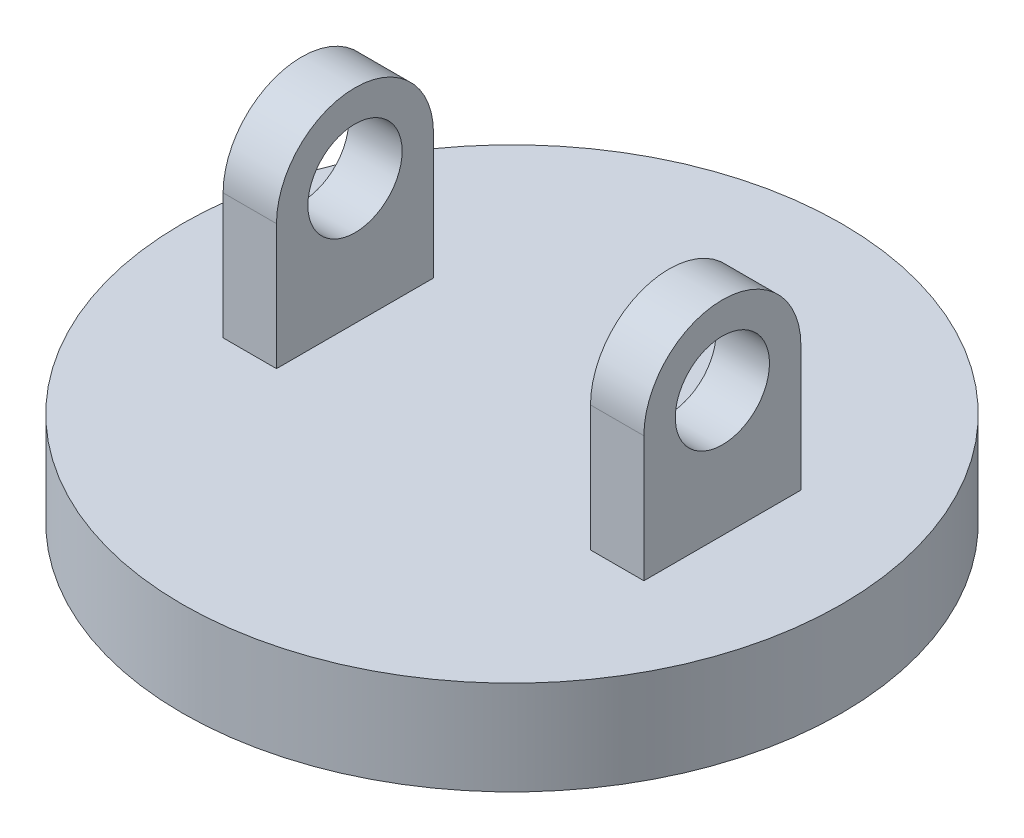
ISO-10303-21;
HEADER;
FILE_DESCRIPTION(('STEP AP214'),'2;1');
FILE_NAME('part.step','',(''),(''),'','','');
FILE_SCHEMA(('AUTOMOTIVE_DESIGN { 1 0 10303 214 1 1 1 1 }'));
ENDSEC;
DATA;
#1=APPLICATION_CONTEXT('core data for automotive mechanical design processes');
#2=APPLICATION_PROTOCOL_DEFINITION('international standard','automotive_design',2000,#1);
#3=PRODUCT_CONTEXT('',#1,'mechanical');
#4=PRODUCT('Part','Part','',(#3));
#5=PRODUCT_RELATED_PRODUCT_CATEGORY('part','',(#4));
#6=PRODUCT_DEFINITION_FORMATION('','',#4);
#7=PRODUCT_DEFINITION_CONTEXT('part definition',#1,'design');
#8=PRODUCT_DEFINITION('design','',#6,#7);
#9=PRODUCT_DEFINITION_SHAPE('','',#8);
#10=(LENGTH_UNIT() NAMED_UNIT(*) SI_UNIT(.MILLI.,.METRE.));
#11=(NAMED_UNIT(*) PLANE_ANGLE_UNIT() SI_UNIT($,.RADIAN.));
#12=(NAMED_UNIT(*) SI_UNIT($,.STERADIAN.) SOLID_ANGLE_UNIT());
#13=UNCERTAINTY_MEASURE_WITH_UNIT(LENGTH_MEASURE(1.E-05),#10,'distance_accuracy_value','');
#14=(GEOMETRIC_REPRESENTATION_CONTEXT(3) GLOBAL_UNCERTAINTY_ASSIGNED_CONTEXT((#13)) GLOBAL_UNIT_ASSIGNED_CONTEXT((#10,
#11,#12)) REPRESENTATION_CONTEXT('',''));
#15=CARTESIAN_POINT('',(0.,0.,0.));
#16=DIRECTION('',(0.,0.,1.));
#17=DIRECTION('',(1.,0.,0.));
#18=AXIS2_PLACEMENT_3D('',#15,#16,#17);
#19=CARTESIAN_POINT('',(0.,76.2,0.));
#20=DIRECTION('',(0.,1.,0.));
#21=DIRECTION('',(0.,0.,1.));
#22=AXIS2_PLACEMENT_3D('',#19,#20,#21);
#23=PLANE('',#22);
#24=CARTESIAN_POINT('',(0.,76.2,0.));
#25=DIRECTION('',(0.,1.,0.));
#26=DIRECTION('',(0.,0.,1.));
#27=AXIS2_PLACEMENT_3D('',#24,#25,#26);
#28=CIRCLE('',#27,266.7);
#29=CARTESIAN_POINT('',(0.,76.2,-266.7));
#30=VERTEX_POINT('',#29);
#31=EDGE_CURVE('E11',#30,#30,#28,.T.);
#32=ORIENTED_EDGE('',*,*,#31,.T.);
#33=EDGE_LOOP('',(#32));
#34=FACE_BOUND('',#33,.T.);
#35=DIRECTION('',(-1.,0.,0.));
#36=VECTOR('',#35,1.);
#37=CARTESIAN_POINT('',(127.,76.2,-63.5));
#38=LINE('',#37,#36);
#39=CARTESIAN_POINT('',(170.18,76.2,-63.5));
#40=VERTEX_POINT('',#39);
#41=CARTESIAN_POINT('',(127.,76.2,-63.5));
#42=VERTEX_POINT('',#41);
#43=EDGE_CURVE('E167',#40,#42,#38,.T.);
#44=ORIENTED_EDGE('',*,*,#43,.F.);
#45=DIRECTION('',(0.,0.,-1.));
#46=VECTOR('',#45,1.);
#47=CARTESIAN_POINT('',(170.18,76.2,63.5));
#48=LINE('',#47,#46);
#49=CARTESIAN_POINT('',(170.18,76.2,63.5));
#50=VERTEX_POINT('',#49);
#51=EDGE_CURVE('E162',#50,#40,#48,.T.);
#52=ORIENTED_EDGE('',*,*,#51,.F.);
#53=DIRECTION('',(1.,0.,0.));
#54=VECTOR('',#53,1.);
#55=CARTESIAN_POINT('',(127.,76.2,63.5));
#56=LINE('',#55,#54);
#57=CARTESIAN_POINT('',(127.,76.2,63.5));
#58=VERTEX_POINT('',#57);
#59=EDGE_CURVE('E163',#58,#50,#56,.T.);
#60=ORIENTED_EDGE('',*,*,#59,.F.);
#61=DIRECTION('',(0.,0.,1.));
#62=VECTOR('',#61,1.);
#63=CARTESIAN_POINT('',(127.,76.2,63.5));
#64=LINE('',#63,#62);
#65=EDGE_CURVE('E120',#42,#58,#64,.T.);
#66=ORIENTED_EDGE('',*,*,#65,.F.);
#67=EDGE_LOOP('',(#44,#52,#60,#66));
#68=FACE_BOUND('',#67,.T.);
#69=DIRECTION('',(-1.,0.,0.));
#70=VECTOR('',#69,1.);
#71=CARTESIAN_POINT('',(-170.18,76.2,-63.5));
#72=LINE('',#71,#70);
#73=CARTESIAN_POINT('',(-127.,76.2,-63.5));
#74=VERTEX_POINT('',#73);
#75=CARTESIAN_POINT('',(-170.18,76.2,-63.5));
#76=VERTEX_POINT('',#75);
#77=EDGE_CURVE('E149',#74,#76,#72,.T.);
#78=ORIENTED_EDGE('',*,*,#77,.F.);
#79=DIRECTION('',(0.,0.,-1.));
#80=VECTOR('',#79,1.);
#81=CARTESIAN_POINT('',(-127.,76.2,63.5));
#82=LINE('',#81,#80);
#83=CARTESIAN_POINT('',(-127.,76.2,63.5));
#84=VERTEX_POINT('',#83);
#85=EDGE_CURVE('E137',#84,#74,#82,.T.);
#86=ORIENTED_EDGE('',*,*,#85,.F.);
#87=DIRECTION('',(1.,0.,0.));
#88=VECTOR('',#87,1.);
#89=CARTESIAN_POINT('',(-170.18,76.2,63.5));
#90=LINE('',#89,#88);
#91=CARTESIAN_POINT('',(-170.18,76.2,63.5));
#92=VERTEX_POINT('',#91);
#93=EDGE_CURVE('E143',#92,#84,#90,.T.);
#94=ORIENTED_EDGE('',*,*,#93,.F.);
#95=DIRECTION('',(0.,0.,1.));
#96=VECTOR('',#95,1.);
#97=CARTESIAN_POINT('',(-170.18,76.2,63.5));
#98=LINE('',#97,#96);
#99=EDGE_CURVE('E151',#76,#92,#98,.T.);
#100=ORIENTED_EDGE('',*,*,#99,.F.);
#101=EDGE_LOOP('',(#78,#86,#94,#100));
#102=FACE_BOUND('',#101,.T.);
#103=ADVANCED_FACE('F38',(#34,#68,#102),#23,.T.);
#104=CARTESIAN_POINT('',(0.,76.2,0.));
#105=DIRECTION('',(0.,-1.,0.));
#106=DIRECTION('',(0.,0.,-1.));
#107=AXIS2_PLACEMENT_3D('',#104,#105,#106);
#108=CYLINDRICAL_SURFACE('',#107,266.7);
#109=CARTESIAN_POINT('',(0.,0.,0.));
#110=DIRECTION('',(0.,1.,0.));
#111=DIRECTION('',(0.,0.,1.));
#112=AXIS2_PLACEMENT_3D('',#109,#110,#111);
#113=CIRCLE('',#112,266.7);
#114=CARTESIAN_POINT('',(0.,0.,-266.7));
#115=VERTEX_POINT('',#114);
#116=EDGE_CURVE('E47',#115,#115,#113,.T.);
#117=CARTESIAN_POINT('',(0.,76.2,-266.7));
#118=CARTESIAN_POINT('',(0.,75.40625,-266.7));
#119=CARTESIAN_POINT('',(0.,74.6125,-266.7));
#120=CARTESIAN_POINT('',(0.,73.025,-266.7));
#121=CARTESIAN_POINT('',(0.,72.23125,-266.7));
#122=CARTESIAN_POINT('',(0.,70.64375,-266.7));
#123=CARTESIAN_POINT('',(0.,69.85,-266.7));
#124=CARTESIAN_POINT('',(0.,68.2625,-266.7));
#125=CARTESIAN_POINT('',(0.,67.46875,-266.7));
#126=CARTESIAN_POINT('',(0.,65.88125,-266.7));
#127=CARTESIAN_POINT('',(0.,65.0875,-266.7));
#128=CARTESIAN_POINT('',(0.,63.5,-266.7));
#129=CARTESIAN_POINT('',(0.,62.70625,-266.7));
#130=CARTESIAN_POINT('',(0.,61.11875,-266.7));
#131=CARTESIAN_POINT('',(0.,60.325,-266.7));
#132=CARTESIAN_POINT('',(0.,58.7375,-266.7));
#133=CARTESIAN_POINT('',(0.,57.94375,-266.7));
#134=CARTESIAN_POINT('',(0.,56.35625,-266.7));
#135=CARTESIAN_POINT('',(0.,55.5625,-266.7));
#136=CARTESIAN_POINT('',(0.,53.975,-266.7));
#137=CARTESIAN_POINT('',(0.,53.18125,-266.7));
#138=CARTESIAN_POINT('',(0.,51.59375,-266.7));
#139=CARTESIAN_POINT('',(0.,50.8,-266.7));
#140=CARTESIAN_POINT('',(0.,49.2125,-266.7));
#141=CARTESIAN_POINT('',(0.,48.41875,-266.7));
#142=CARTESIAN_POINT('',(0.,46.83125,-266.7));
#143=CARTESIAN_POINT('',(0.,46.0375,-266.7));
#144=CARTESIAN_POINT('',(0.,44.45,-266.7));
#145=CARTESIAN_POINT('',(0.,43.65625,-266.7));
#146=CARTESIAN_POINT('',(0.,42.06875,-266.7));
#147=CARTESIAN_POINT('',(0.,41.275,-266.7));
#148=CARTESIAN_POINT('',(0.,39.6875,-266.7));
#149=CARTESIAN_POINT('',(0.,38.89375,-266.7));
#150=CARTESIAN_POINT('',(0.,37.30625,-266.7));
#151=CARTESIAN_POINT('',(0.,36.5125,-266.7));
#152=CARTESIAN_POINT('',(0.,34.925,-266.7));
#153=CARTESIAN_POINT('',(0.,34.13125,-266.7));
#154=CARTESIAN_POINT('',(0.,32.54375,-266.7));
#155=CARTESIAN_POINT('',(0.,31.75,-266.7));
#156=CARTESIAN_POINT('',(0.,30.1625,-266.7));
#157=CARTESIAN_POINT('',(0.,29.36875,-266.7));
#158=CARTESIAN_POINT('',(0.,27.78125,-266.7));
#159=CARTESIAN_POINT('',(0.,26.9875,-266.7));
#160=CARTESIAN_POINT('',(0.,25.4,-266.7));
#161=CARTESIAN_POINT('',(0.,24.60625,-266.7));
#162=CARTESIAN_POINT('',(0.,23.01875,-266.7));
#163=CARTESIAN_POINT('',(0.,22.225,-266.7));
#164=CARTESIAN_POINT('',(0.,20.6375,-266.7));
#165=CARTESIAN_POINT('',(0.,19.84375,-266.7));
#166=CARTESIAN_POINT('',(0.,18.25625,-266.7));
#167=CARTESIAN_POINT('',(0.,17.4625,-266.7));
#168=CARTESIAN_POINT('',(0.,15.875,-266.7));
#169=CARTESIAN_POINT('',(0.,15.08125,-266.7));
#170=CARTESIAN_POINT('',(0.,13.49375,-266.7));
#171=CARTESIAN_POINT('',(0.,12.7,-266.7));
#172=CARTESIAN_POINT('',(0.,11.1125,-266.7));
#173=CARTESIAN_POINT('',(0.,10.31875,-266.7));
#174=CARTESIAN_POINT('',(0.,8.73125,-266.7));
#175=CARTESIAN_POINT('',(0.,7.93750000000001,-266.7));
#176=CARTESIAN_POINT('',(0.,6.35,-266.7));
#177=CARTESIAN_POINT('',(0.,5.55625,-266.7));
#178=CARTESIAN_POINT('',(0.,3.96875,-266.7));
#179=CARTESIAN_POINT('',(0.,3.175,-266.7));
#180=CARTESIAN_POINT('',(0.,1.5875,-266.7));
#181=CARTESIAN_POINT('',(0.,0.793750000000001,-266.7));
#182=CARTESIAN_POINT('',(0.,0.,-266.7));
#183=B_SPLINE_CURVE_WITH_KNOTS('',3,(#117,#118,#119,#120,#121,#122,#123,#124,#125,#126,#127,
#128,#129,#130,#131,#132,#133,#134,#135,#136,#137,#138,#139,#140,#141,#142,#143,#144,#145,#146,
#147,#148,#149,#150,#151,#152,#153,#154,#155,#156,#157,#158,#159,#160,#161,#162,#163,#164,#165,
#166,#167,#168,#169,#170,#171,#172,#173,#174,#175,#176,#177,#178,#179,#180,#181,#182),
.UNSPECIFIED.,.F.,.F.,(4,2,2,2,2,2,2,2,2,2,2,2,2,2,2,2,2,2,2,2,2,2,2,2,2,2,2,2,2,2,2,2,4),(0.,
2.38125,4.7625,7.14375,9.52500000000001,11.90625,14.2875,16.66875,19.05,21.43125,23.8125,
26.19375,28.575,30.95625,33.3375,35.71875,38.1,40.48125,42.8625,45.24375,47.625,50.00625,
52.3875,54.76875,57.15,59.53125,61.9125,64.29375,66.675,69.05625,71.4375,73.81875,76.2),.UNSPECIFIED.);
#184=EDGE_CURVE('BSEAM40',#30,#115,#183,.T.);
#185=ORIENTED_EDGE('',*,*,#31,.F.);
#186=ORIENTED_EDGE('',*,*,#116,.T.);
#187=ORIENTED_EDGE('',*,*,#184,.T.);
#188=ORIENTED_EDGE('',*,*,#184,.F.);
#189=EDGE_LOOP('',(#185,#187,#186,#188));
#190=FACE_BOUND('',#189,.T.);
#191=ADVANCED_FACE('F40',(#190),#108,.T.);
#192=CARTESIAN_POINT('',(0.,0.,0.));
#193=DIRECTION('',(0.,1.,0.));
#194=DIRECTION('',(0.,0.,1.));
#195=AXIS2_PLACEMENT_3D('',#192,#193,#194);
#196=PLANE('',#195);
#197=CARTESIAN_POINT('',(0.,0.,0.));
#198=DIRECTION('',(0.,-1.,0.));
#199=DIRECTION('',(0.,0.,-1.));
#200=AXIS2_PLACEMENT_3D('',#197,#198,#199);
#201=CIRCLE('',#200,241.3);
#202=CARTESIAN_POINT('',(0.,0.,-241.3));
#203=VERTEX_POINT('',#202);
#204=EDGE_CURVE('E194',#203,#203,#201,.T.);
#205=ORIENTED_EDGE('',*,*,#204,.F.);
#206=EDGE_LOOP('',(#205));
#207=FACE_BOUND('',#206,.T.);
#208=ORIENTED_EDGE('',*,*,#116,.F.);
#209=EDGE_LOOP('',(#208));
#210=FACE_BOUND('',#209,.T.);
#211=ADVANCED_FACE('F202',(#207,#210),#196,.F.);
#212=CARTESIAN_POINT('',(0.,25.4,0.));
#213=DIRECTION('',(0.,-1.,0.));
#214=DIRECTION('',(0.,0.,-1.));
#215=AXIS2_PLACEMENT_3D('',#212,#213,#214);
#216=CYLINDRICAL_SURFACE('',#215,241.3);
#217=CARTESIAN_POINT('',(0.,25.4,0.));
#218=DIRECTION('',(0.,-1.,0.));
#219=DIRECTION('',(0.,0.,-1.));
#220=AXIS2_PLACEMENT_3D('',#217,#218,#219);
#221=CIRCLE('',#220,241.3);
#222=CARTESIAN_POINT('',(0.,25.4,-241.3));
#223=VERTEX_POINT('',#222);
#224=EDGE_CURVE('E185',#223,#223,#221,.T.);
#225=ORIENTED_EDGE('',*,*,#224,.F.);
#226=EDGE_LOOP('',(#225));
#227=FACE_BOUND('',#226,.T.);
#228=ORIENTED_EDGE('',*,*,#204,.T.);
#229=EDGE_LOOP('',(#228));
#230=FACE_BOUND('',#229,.T.);
#231=ADVANCED_FACE('F204',(#227,#230),#216,.F.);
#232=CARTESIAN_POINT('',(0.,25.4,0.));
#233=DIRECTION('',(0.,-1.,0.));
#234=DIRECTION('',(0.,0.,-1.));
#235=AXIS2_PLACEMENT_3D('',#232,#233,#234);
#236=PLANE('',#235);
#237=CARTESIAN_POINT('',(0.,25.4,0.));
#238=DIRECTION('',(0.,-1.,0.));
#239=DIRECTION('',(0.,0.,-1.));
#240=AXIS2_PLACEMENT_3D('',#237,#238,#239);
#241=CIRCLE('',#240,203.2);
#242=CARTESIAN_POINT('',(0.,25.4,-203.2));
#243=VERTEX_POINT('',#242);
#244=EDGE_CURVE('E175',#243,#243,#241,.T.);
#245=ORIENTED_EDGE('',*,*,#244,.T.);
#246=EDGE_LOOP('',(#245));
#247=FACE_BOUND('',#246,.T.);
#248=CARTESIAN_POINT('',(0.,25.4,0.));
#249=DIRECTION('',(0.,-1.,0.));
#250=DIRECTION('',(0.,0.,-1.));
#251=AXIS2_PLACEMENT_3D('',#248,#249,#250);
#252=CIRCLE('',#251,215.9);
#253=CARTESIAN_POINT('',(0.,25.4,-215.9));
#254=VERTEX_POINT('',#253);
#255=EDGE_CURVE('E188',#254,#254,#252,.T.);
#256=ORIENTED_EDGE('',*,*,#255,.F.);
#257=EDGE_LOOP('',(#256));
#258=FACE_BOUND('',#257,.T.);
#259=ADVANCED_FACE('F211',(#247,#258),#236,.F.);
#260=CARTESIAN_POINT('',(0.,50.8,0.));
#261=DIRECTION('',(0.,-1.,0.));
#262=DIRECTION('',(0.,0.,-1.));
#263=AXIS2_PLACEMENT_3D('',#260,#261,#262);
#264=CYLINDRICAL_SURFACE('',#263,254.);
#265=CARTESIAN_POINT('',(0.,50.8,0.));
#266=DIRECTION('',(0.,-1.,0.));
#267=DIRECTION('',(0.,0.,-1.));
#268=AXIS2_PLACEMENT_3D('',#265,#266,#267);
#269=CIRCLE('',#268,254.);
#270=CARTESIAN_POINT('',(0.,50.8,-254.));
#271=VERTEX_POINT('',#270);
#272=EDGE_CURVE('E182',#271,#271,#269,.T.);
#273=ORIENTED_EDGE('',*,*,#272,.F.);
#274=EDGE_LOOP('',(#273));
#275=FACE_BOUND('',#274,.T.);
#276=CARTESIAN_POINT('',(0.,25.4,0.));
#277=DIRECTION('',(0.,-1.,0.));
#278=DIRECTION('',(0.,0.,-1.));
#279=AXIS2_PLACEMENT_3D('',#276,#277,#278);
#280=CIRCLE('',#279,254.);
#281=CARTESIAN_POINT('',(0.,25.4,-254.));
#282=VERTEX_POINT('',#281);
#283=EDGE_CURVE('E179',#282,#282,#280,.T.);
#284=ORIENTED_EDGE('',*,*,#283,.T.);
#285=EDGE_LOOP('',(#284));
#286=FACE_BOUND('',#285,.T.);
#287=ADVANCED_FACE('F231',(#275,#286),#264,.F.);
#288=CARTESIAN_POINT('',(0.,50.8,0.));
#289=DIRECTION('',(0.,-1.,0.));
#290=DIRECTION('',(0.,0.,-1.));
#291=AXIS2_PLACEMENT_3D('',#288,#289,#290);
#292=PLANE('',#291);
#293=CARTESIAN_POINT('',(0.,50.8,0.));
#294=DIRECTION('',(0.,-1.,0.));
#295=DIRECTION('',(0.,0.,-1.));
#296=AXIS2_PLACEMENT_3D('',#293,#294,#295);
#297=CIRCLE('',#296,203.2);
#298=CARTESIAN_POINT('',(0.,50.8,-203.2));
#299=VERTEX_POINT('',#298);
#300=EDGE_CURVE('E176',#299,#299,#297,.T.);
#301=ORIENTED_EDGE('',*,*,#300,.F.);
#302=EDGE_LOOP('',(#301));
#303=FACE_BOUND('',#302,.T.);
#304=ORIENTED_EDGE('',*,*,#272,.T.);
#305=EDGE_LOOP('',(#304));
#306=FACE_BOUND('',#305,.T.);
#307=ADVANCED_FACE('F234',(#303,#306),#292,.T.);
#308=ORIENTED_EDGE('',*,*,#224,.T.);
#309=EDGE_LOOP('',(#308));
#310=FACE_BOUND('',#309,.T.);
#311=ORIENTED_EDGE('',*,*,#283,.F.);
#312=EDGE_LOOP('',(#311));
#313=FACE_BOUND('',#312,.T.);
#314=ADVANCED_FACE('F236',(#310,#313),#236,.F.);
#315=CARTESIAN_POINT('',(0.,50.8,0.));
#316=DIRECTION('',(0.,-1.,0.));
#317=DIRECTION('',(0.,0.,-1.));
#318=AXIS2_PLACEMENT_3D('',#315,#316,#317);
#319=CYLINDRICAL_SURFACE('',#318,203.2);
#320=ORIENTED_EDGE('',*,*,#300,.T.);
#321=EDGE_LOOP('',(#320));
#322=FACE_BOUND('',#321,.T.);
#323=ORIENTED_EDGE('',*,*,#244,.F.);
#324=EDGE_LOOP('',(#323));
#325=FACE_BOUND('',#324,.T.);
#326=ADVANCED_FACE('F219',(#322,#325),#319,.T.);
#327=CARTESIAN_POINT('',(0.,0.,0.));
#328=DIRECTION('',(0.,-1.,0.));
#329=DIRECTION('',(0.,0.,-1.));
#330=AXIS2_PLACEMENT_3D('',#327,#328,#329);
#331=CIRCLE('',#330,215.9);
#332=CARTESIAN_POINT('',(0.,0.,-215.9));
#333=VERTEX_POINT('',#332);
#334=EDGE_CURVE('E191',#333,#333,#331,.T.);
#335=ORIENTED_EDGE('',*,*,#334,.T.);
#336=EDGE_LOOP('',(#335));
#337=FACE_BOUND('',#336,.T.);
#338=ADVANCED_FACE('F206',(#337),#196,.F.);
#339=CARTESIAN_POINT('',(0.,25.4,0.));
#340=DIRECTION('',(0.,-1.,0.));
#341=DIRECTION('',(0.,0.,-1.));
#342=AXIS2_PLACEMENT_3D('',#339,#340,#341);
#343=CYLINDRICAL_SURFACE('',#342,215.9);
#344=ORIENTED_EDGE('',*,*,#255,.T.);
#345=EDGE_LOOP('',(#344));
#346=FACE_BOUND('',#345,.T.);
#347=ORIENTED_EDGE('',*,*,#334,.F.);
#348=EDGE_LOOP('',(#347));
#349=FACE_BOUND('',#348,.T.);
#350=ADVANCED_FACE('F218',(#346,#349),#343,.T.);
#351=CARTESIAN_POINT('',(170.18,177.8,63.5));
#352=DIRECTION('',(-1.,0.,0.));
#353=DIRECTION('',(0.,0.,1.));
#354=AXIS2_PLACEMENT_3D('',#351,#352,#353);
#355=PLANE('',#354);
#356=CARTESIAN_POINT('',(170.18,177.8,0.));
#357=DIRECTION('',(1.,0.,0.));
#358=DIRECTION('',(0.,0.,-1.));
#359=AXIS2_PLACEMENT_3D('',#356,#357,#358);
#360=CIRCLE('',#359,38.1);
#361=CARTESIAN_POINT('',(170.18,177.8,-38.1));
#362=VERTEX_POINT('',#361);
#363=EDGE_CURVE('E290',#362,#362,#360,.T.);
#364=ORIENTED_EDGE('',*,*,#363,.F.);
#365=EDGE_LOOP('',(#364));
#366=FACE_BOUND('',#365,.T.);
#367=ORIENTED_EDGE('',*,*,#51,.T.);
#368=DIRECTION('',(0.,-1.,0.));
#369=VECTOR('',#368,1.);
#370=CARTESIAN_POINT('',(170.18,177.8,-63.5));
#371=LINE('',#370,#369);
#372=CARTESIAN_POINT('',(170.18,177.8,-63.5));
#373=VERTEX_POINT('',#372);
#374=EDGE_CURVE('E173',#373,#40,#371,.T.);
#375=ORIENTED_EDGE('',*,*,#374,.F.);
#376=CARTESIAN_POINT('',(170.18,177.8,0.));
#377=DIRECTION('',(1.,0.,0.));
#378=DIRECTION('',(0.,0.,-1.));
#379=AXIS2_PLACEMENT_3D('',#376,#377,#378);
#380=CIRCLE('',#379,63.5);
#381=CARTESIAN_POINT('',(170.18,177.8,63.5));
#382=VERTEX_POINT('',#381);
#383=EDGE_CURVE('E126',#373,#382,#380,.T.);
#384=ORIENTED_EDGE('',*,*,#383,.T.);
#385=DIRECTION('',(0.,-1.,0.));
#386=VECTOR('',#385,1.);
#387=CARTESIAN_POINT('',(170.18,177.8,63.5));
#388=LINE('',#387,#386);
#389=EDGE_CURVE('E106',#382,#50,#388,.T.);
#390=ORIENTED_EDGE('',*,*,#389,.T.);
#391=EDGE_LOOP('',(#367,#375,#384,#390));
#392=FACE_BOUND('',#391,.T.);
#393=ADVANCED_FACE('F229',(#366,#392),#355,.F.);
#394=CARTESIAN_POINT('',(127.,177.8,-63.5));
#395=DIRECTION('',(0.,0.,1.));
#396=DIRECTION('',(1.,0.,0.));
#397=AXIS2_PLACEMENT_3D('',#394,#395,#396);
#398=PLANE('',#397);
#399=ORIENTED_EDGE('',*,*,#43,.T.);
#400=DIRECTION('',(0.,-1.,0.));
#401=VECTOR('',#400,1.);
#402=CARTESIAN_POINT('',(127.,177.8,-63.5));
#403=LINE('',#402,#401);
#404=CARTESIAN_POINT('',(127.,177.8,-63.5));
#405=VERTEX_POINT('',#404);
#406=EDGE_CURVE('E122',#405,#42,#403,.T.);
#407=ORIENTED_EDGE('',*,*,#406,.F.);
#408=DIRECTION('',(-1.,0.,0.));
#409=VECTOR('',#408,1.);
#410=CARTESIAN_POINT('',(127.,177.8,-63.5));
#411=LINE('',#410,#409);
#412=EDGE_CURVE('E111',#373,#405,#411,.T.);
#413=ORIENTED_EDGE('',*,*,#412,.F.);
#414=ORIENTED_EDGE('',*,*,#374,.T.);
#415=EDGE_LOOP('',(#399,#407,#413,#414));
#416=FACE_BOUND('',#415,.T.);
#417=ADVANCED_FACE('F248',(#416),#398,.F.);
#418=CARTESIAN_POINT('',(127.,177.8,63.5));
#419=DIRECTION('',(1.,0.,0.));
#420=DIRECTION('',(0.,0.,-1.));
#421=AXIS2_PLACEMENT_3D('',#418,#419,#420);
#422=PLANE('',#421);
#423=CARTESIAN_POINT('',(127.,177.8,0.));
#424=DIRECTION('',(1.,0.,0.));
#425=DIRECTION('',(0.,0.,-1.));
#426=AXIS2_PLACEMENT_3D('',#423,#424,#425);
#427=CIRCLE('',#426,38.1);
#428=CARTESIAN_POINT('',(127.,177.8,-38.1));
#429=VERTEX_POINT('',#428);
#430=EDGE_CURVE('E131',#429,#429,#427,.T.);
#431=ORIENTED_EDGE('',*,*,#430,.T.);
#432=EDGE_LOOP('',(#431));
#433=FACE_BOUND('',#432,.T.);
#434=ORIENTED_EDGE('',*,*,#65,.T.);
#435=DIRECTION('',(0.,-1.,0.));
#436=VECTOR('',#435,1.);
#437=CARTESIAN_POINT('',(127.,177.8,63.5));
#438=LINE('',#437,#436);
#439=CARTESIAN_POINT('',(127.,177.8,63.5));
#440=VERTEX_POINT('',#439);
#441=EDGE_CURVE('E63',#440,#58,#438,.T.);
#442=ORIENTED_EDGE('',*,*,#441,.F.);
#443=CARTESIAN_POINT('',(127.,177.8,0.));
#444=DIRECTION('',(1.,0.,0.));
#445=DIRECTION('',(0.,0.,-1.));
#446=AXIS2_PLACEMENT_3D('',#443,#444,#445);
#447=CIRCLE('',#446,63.5);
#448=EDGE_CURVE('E117',#440,#405,#447,.F.);
#449=ORIENTED_EDGE('',*,*,#448,.T.);
#450=ORIENTED_EDGE('',*,*,#406,.T.);
#451=EDGE_LOOP('',(#434,#442,#449,#450));
#452=FACE_BOUND('',#451,.T.);
#453=ADVANCED_FACE('F115',(#433,#452),#422,.F.);
#454=CARTESIAN_POINT('',(127.,177.8,63.5));
#455=DIRECTION('',(0.,0.,-1.));
#456=DIRECTION('',(-1.,0.,0.));
#457=AXIS2_PLACEMENT_3D('',#454,#455,#456);
#458=PLANE('',#457);
#459=ORIENTED_EDGE('',*,*,#59,.T.);
#460=ORIENTED_EDGE('',*,*,#389,.F.);
#461=DIRECTION('',(1.,0.,0.));
#462=VECTOR('',#461,1.);
#463=CARTESIAN_POINT('',(127.,177.8,63.5));
#464=LINE('',#463,#462);
#465=EDGE_CURVE('E103',#440,#382,#464,.T.);
#466=ORIENTED_EDGE('',*,*,#465,.F.);
#467=ORIENTED_EDGE('',*,*,#441,.T.);
#468=EDGE_LOOP('',(#459,#460,#466,#467));
#469=FACE_BOUND('',#468,.T.);
#470=ADVANCED_FACE('F104',(#469),#458,.F.);
#471=CARTESIAN_POINT('',(-127.,177.8,63.5));
#472=DIRECTION('',(-1.,0.,0.));
#473=DIRECTION('',(0.,0.,1.));
#474=AXIS2_PLACEMENT_3D('',#471,#472,#473);
#475=PLANE('',#474);
#476=CARTESIAN_POINT('',(-127.,177.8,0.));
#477=DIRECTION('',(-1.,0.,0.));
#478=DIRECTION('',(0.,0.,1.));
#479=AXIS2_PLACEMENT_3D('',#476,#477,#478);
#480=CIRCLE('',#479,38.1);
#481=CARTESIAN_POINT('',(-127.,177.8,38.1));
#482=VERTEX_POINT('',#481);
#483=EDGE_CURVE('E293',#482,#482,#480,.T.);
#484=ORIENTED_EDGE('',*,*,#483,.T.);
#485=EDGE_LOOP('',(#484));
#486=FACE_BOUND('',#485,.T.);
#487=ORIENTED_EDGE('',*,*,#85,.T.);
#488=DIRECTION('',(0.,-1.,0.));
#489=VECTOR('',#488,1.);
#490=CARTESIAN_POINT('',(-127.,177.8,-63.5));
#491=LINE('',#490,#489);
#492=CARTESIAN_POINT('',(-127.,177.8,-63.5));
#493=VERTEX_POINT('',#492);
#494=EDGE_CURVE('E160',#493,#74,#491,.T.);
#495=ORIENTED_EDGE('',*,*,#494,.F.);
#496=CARTESIAN_POINT('',(-127.,177.8,0.));
#497=DIRECTION('',(-1.,0.,0.));
#498=DIRECTION('',(0.,0.,1.));
#499=AXIS2_PLACEMENT_3D('',#496,#497,#498);
#500=CIRCLE('',#499,63.5);
#501=CARTESIAN_POINT('',(-127.,177.8,63.5));
#502=VERTEX_POINT('',#501);
#503=EDGE_CURVE('E129',#502,#493,#500,.T.);
#504=ORIENTED_EDGE('',*,*,#503,.F.);
#505=DIRECTION('',(0.,-1.,0.));
#506=VECTOR('',#505,1.);
#507=CARTESIAN_POINT('',(-127.,177.8,63.5));
#508=LINE('',#507,#506);
#509=EDGE_CURVE('E146',#502,#84,#508,.T.);
#510=ORIENTED_EDGE('',*,*,#509,.T.);
#511=EDGE_LOOP('',(#487,#495,#504,#510));
#512=FACE_BOUND('',#511,.T.);
#513=ADVANCED_FACE('F258',(#486,#512),#475,.F.);
#514=CARTESIAN_POINT('',(-170.18,177.8,-63.5));
#515=DIRECTION('',(0.,0.,1.));
#516=DIRECTION('',(1.,0.,0.));
#517=AXIS2_PLACEMENT_3D('',#514,#515,#516);
#518=PLANE('',#517);
#519=ORIENTED_EDGE('',*,*,#77,.T.);
#520=DIRECTION('',(0.,-1.,0.));
#521=VECTOR('',#520,1.);
#522=CARTESIAN_POINT('',(-170.18,177.8,-63.5));
#523=LINE('',#522,#521);
#524=CARTESIAN_POINT('',(-170.18,177.8,-63.5));
#525=VERTEX_POINT('',#524);
#526=EDGE_CURVE('E157',#525,#76,#523,.T.);
#527=ORIENTED_EDGE('',*,*,#526,.F.);
#528=DIRECTION('',(-1.,0.,0.));
#529=VECTOR('',#528,1.);
#530=CARTESIAN_POINT('',(-170.18,177.8,-63.5));
#531=LINE('',#530,#529);
#532=EDGE_CURVE('E139',#493,#525,#531,.T.);
#533=ORIENTED_EDGE('',*,*,#532,.F.);
#534=ORIENTED_EDGE('',*,*,#494,.T.);
#535=EDGE_LOOP('',(#519,#527,#533,#534));
#536=FACE_BOUND('',#535,.T.);
#537=ADVANCED_FACE('F261',(#536),#518,.F.);
#538=CARTESIAN_POINT('',(-170.18,177.8,63.5));
#539=DIRECTION('',(1.,0.,0.));
#540=DIRECTION('',(0.,0.,-1.));
#541=AXIS2_PLACEMENT_3D('',#538,#539,#540);
#542=PLANE('',#541);
#543=CARTESIAN_POINT('',(-170.18,177.8,0.));
#544=DIRECTION('',(1.,0.,0.));
#545=DIRECTION('',(0.,0.,-1.));
#546=AXIS2_PLACEMENT_3D('',#543,#544,#545);
#547=CIRCLE('',#546,38.1);
#548=CARTESIAN_POINT('',(-170.18,177.8,-38.1));
#549=VERTEX_POINT('',#548);
#550=EDGE_CURVE('E42',#549,#549,#547,.T.);
#551=ORIENTED_EDGE('',*,*,#550,.T.);
#552=EDGE_LOOP('',(#551));
#553=FACE_BOUND('',#552,.T.);
#554=ORIENTED_EDGE('',*,*,#99,.T.);
#555=DIRECTION('',(0.,-1.,0.));
#556=VECTOR('',#555,1.);
#557=CARTESIAN_POINT('',(-170.18,177.8,63.5));
#558=LINE('',#557,#556);
#559=CARTESIAN_POINT('',(-170.18,177.8,63.5));
#560=VERTEX_POINT('',#559);
#561=EDGE_CURVE('E55',#560,#92,#558,.T.);
#562=ORIENTED_EDGE('',*,*,#561,.F.);
#563=CARTESIAN_POINT('',(-170.18,177.8,0.));
#564=DIRECTION('',(1.,0.,0.));
#565=DIRECTION('',(0.,0.,-1.));
#566=AXIS2_PLACEMENT_3D('',#563,#564,#565);
#567=CIRCLE('',#566,63.5);
#568=EDGE_CURVE('E125',#525,#560,#567,.T.);
#569=ORIENTED_EDGE('',*,*,#568,.F.);
#570=ORIENTED_EDGE('',*,*,#526,.T.);
#571=EDGE_LOOP('',(#554,#562,#569,#570));
#572=FACE_BOUND('',#571,.T.);
#573=ADVANCED_FACE('F265',(#553,#572),#542,.F.);
#574=CARTESIAN_POINT('',(-170.18,177.8,63.5));
#575=DIRECTION('',(0.,0.,-1.));
#576=DIRECTION('',(-1.,0.,0.));
#577=AXIS2_PLACEMENT_3D('',#574,#575,#576);
#578=PLANE('',#577);
#579=ORIENTED_EDGE('',*,*,#93,.T.);
#580=ORIENTED_EDGE('',*,*,#509,.F.);
#581=DIRECTION('',(1.,0.,0.));
#582=VECTOR('',#581,1.);
#583=CARTESIAN_POINT('',(-170.18,177.8,63.5));
#584=LINE('',#583,#582);
#585=EDGE_CURVE('E142',#560,#502,#584,.T.);
#586=ORIENTED_EDGE('',*,*,#585,.F.);
#587=ORIENTED_EDGE('',*,*,#561,.T.);
#588=EDGE_LOOP('',(#579,#580,#586,#587));
#589=FACE_BOUND('',#588,.T.);
#590=ADVANCED_FACE('F269',(#589),#578,.F.);
#591=CARTESIAN_POINT('',(14.9903165712366,177.8,0.));
#592=DIRECTION('',(-1.,0.,0.));
#593=DIRECTION('',(0.,0.,1.));
#594=AXIS2_PLACEMENT_3D('',#591,#592,#593);
#595=CYLINDRICAL_SURFACE('',#594,63.5);
#596=ORIENTED_EDGE('',*,*,#585,.T.);
#597=ORIENTED_EDGE('',*,*,#503,.T.);
#598=ORIENTED_EDGE('',*,*,#532,.T.);
#599=ORIENTED_EDGE('',*,*,#568,.T.);
#600=EDGE_LOOP('',(#596,#597,#598,#599));
#601=FACE_BOUND('',#600,.T.);
#602=ADVANCED_FACE('F273',(#601),#595,.T.);
#603=CARTESIAN_POINT('',(-14.9903165712368,177.8,0.));
#604=DIRECTION('',(1.,0.,0.));
#605=DIRECTION('',(0.,0.,-1.));
#606=AXIS2_PLACEMENT_3D('',#603,#604,#605);
#607=CYLINDRICAL_SURFACE('',#606,63.5);
#608=ORIENTED_EDGE('',*,*,#448,.F.);
#609=ORIENTED_EDGE('',*,*,#465,.T.);
#610=ORIENTED_EDGE('',*,*,#383,.F.);
#611=ORIENTED_EDGE('',*,*,#412,.T.);
#612=EDGE_LOOP('',(#608,#609,#610,#611));
#613=FACE_BOUND('',#612,.T.);
#614=ADVANCED_FACE('F124',(#613),#607,.T.);
#615=CARTESIAN_POINT('',(-266.7,177.8,0.));
#616=DIRECTION('',(1.,0.,0.));
#617=DIRECTION('',(0.,0.,-1.));
#618=AXIS2_PLACEMENT_3D('',#615,#616,#617);
#619=CYLINDRICAL_SURFACE('',#618,38.1);
#620=ORIENTED_EDGE('',*,*,#550,.F.);
#621=EDGE_LOOP('',(#620));
#622=FACE_BOUND('',#621,.T.);
#623=ORIENTED_EDGE('',*,*,#483,.F.);
#624=EDGE_LOOP('',(#623));
#625=FACE_BOUND('',#624,.T.);
#626=ADVANCED_FACE('F279',(#622,#625),#619,.F.);
#627=ORIENTED_EDGE('',*,*,#363,.T.);
#628=EDGE_LOOP('',(#627));
#629=FACE_BOUND('',#628,.T.);
#630=ORIENTED_EDGE('',*,*,#430,.F.);
#631=EDGE_LOOP('',(#630));
#632=FACE_BOUND('',#631,.T.);
#633=ADVANCED_FACE('F280',(#629,#632),#619,.F.);
#634=CLOSED_SHELL('',(#103,#191,#211,#231,#259,#287,#307,#314,#326,#338,#350,#393,#417,#453,
#470,#513,#537,#573,#590,#602,#614,#626,#633));
#635=MANIFOLD_SOLID_BREP('B2',#634);
#636=ADVANCED_BREP_SHAPE_REPRESENTATION('',(#18,#635),#14);
#637=SHAPE_DEFINITION_REPRESENTATION(#9,#636);
ENDSEC;
END-ISO-10303-21;
